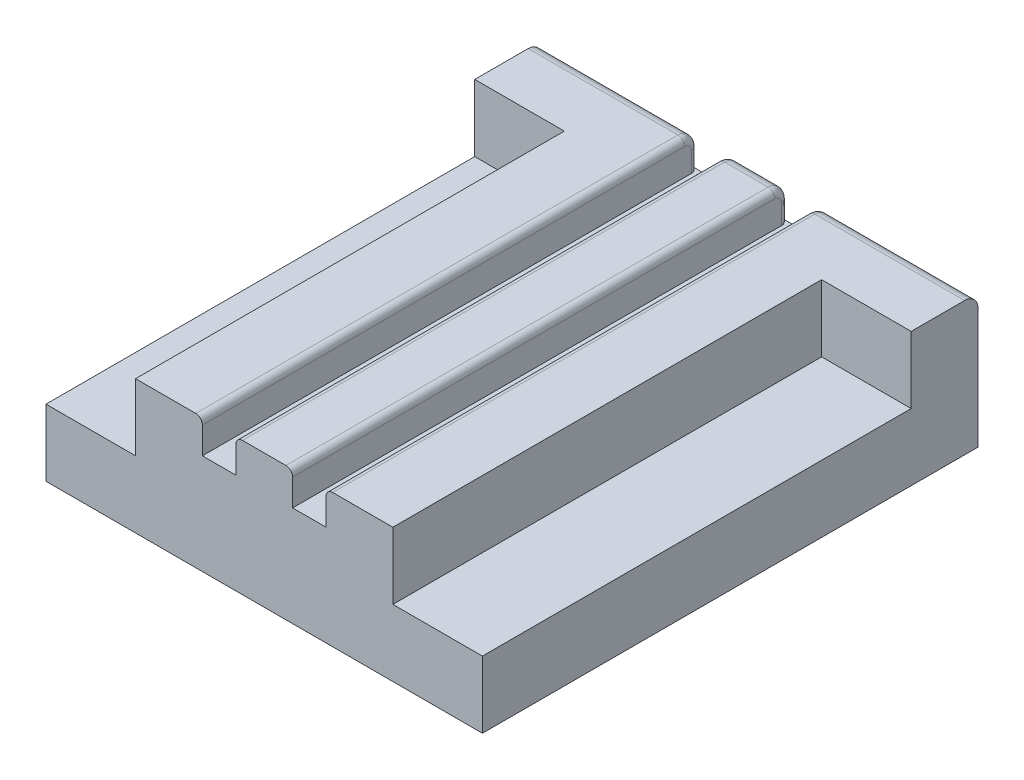
ISO-10303-21;
HEADER;
FILE_DESCRIPTION(('STEP AP214'),'2;1');
FILE_NAME('part.step','',(''),(''),'','','');
FILE_SCHEMA(('AUTOMOTIVE_DESIGN { 1 0 10303 214 1 1 1 1 }'));
ENDSEC;
DATA;
#1=APPLICATION_CONTEXT('core data for automotive mechanical design processes');
#2=APPLICATION_PROTOCOL_DEFINITION('international standard','automotive_design',2000,#1);
#3=PRODUCT_CONTEXT('',#1,'mechanical');
#4=PRODUCT('Part','Part','',(#3));
#5=PRODUCT_RELATED_PRODUCT_CATEGORY('part','',(#4));
#6=PRODUCT_DEFINITION_FORMATION('','',#4);
#7=PRODUCT_DEFINITION_CONTEXT('part definition',#1,'design');
#8=PRODUCT_DEFINITION('design','',#6,#7);
#9=PRODUCT_DEFINITION_SHAPE('','',#8);
#10=(LENGTH_UNIT() NAMED_UNIT(*) SI_UNIT(.MILLI.,.METRE.));
#11=(NAMED_UNIT(*) PLANE_ANGLE_UNIT() SI_UNIT($,.RADIAN.));
#12=(NAMED_UNIT(*) SI_UNIT($,.STERADIAN.) SOLID_ANGLE_UNIT());
#13=UNCERTAINTY_MEASURE_WITH_UNIT(LENGTH_MEASURE(1.E-05),#10,'distance_accuracy_value','');
#14=(GEOMETRIC_REPRESENTATION_CONTEXT(3) GLOBAL_UNCERTAINTY_ASSIGNED_CONTEXT((#13)) GLOBAL_UNIT_ASSIGNED_CONTEXT((#10,
#11,#12)) REPRESENTATION_CONTEXT('',''));
#15=CARTESIAN_POINT('',(0.,0.,0.));
#16=DIRECTION('',(0.,0.,1.));
#17=DIRECTION('',(1.,0.,0.));
#18=AXIS2_PLACEMENT_3D('',#15,#16,#17);
#19=CARTESIAN_POINT('',(0.,20.,0.));
#20=DIRECTION('',(0.,-1.,0.));
#21=DIRECTION('',(0.,0.,-1.));
#22=AXIS2_PLACEMENT_3D('',#19,#20,#21);
#23=PLANE('',#22);
#24=DIRECTION('',(0.,0.,-1.));
#25=VECTOR('',#24,1.);
#26=CARTESIAN_POINT('',(-19.25,20.,-40.5));
#27=LINE('',#26,#25);
#28=CARTESIAN_POINT('',(-19.25,20.,-75.85));
#29=VERTEX_POINT('',#28);
#30=CARTESIAN_POINT('',(-19.25,20.,-140.));
#31=VERTEX_POINT('',#30);
#32=EDGE_CURVE('E265',#29,#31,#27,.T.);
#33=ORIENTED_EDGE('',*,*,#32,.F.);
#34=DIRECTION('',(-1.,0.,0.));
#35=VECTOR('',#34,1.);
#36=CARTESIAN_POINT('',(-120.,20.,-75.85));
#37=LINE('',#36,#35);
#38=CARTESIAN_POINT('',(-10.25,20.,-75.85));
#39=VERTEX_POINT('',#38);
#40=EDGE_CURVE('E258',#39,#29,#37,.T.);
#41=ORIENTED_EDGE('',*,*,#40,.F.);
#42=DIRECTION('',(0.,0.,-1.));
#43=VECTOR('',#42,1.);
#44=CARTESIAN_POINT('',(-10.25,20.,-148.));
#45=LINE('',#44,#43);
#46=CARTESIAN_POINT('',(-10.25,20.,-148.));
#47=VERTEX_POINT('',#46);
#48=EDGE_CURVE('E58',#39,#47,#45,.T.);
#49=ORIENTED_EDGE('',*,*,#48,.T.);
#50=DIRECTION('',(1.,0.,0.));
#51=VECTOR('',#50,1.);
#52=CARTESIAN_POINT('',(-60.,20.,-148.));
#53=LINE('',#52,#51);
#54=CARTESIAN_POINT('',(-32.65,20.,-148.));
#55=VERTEX_POINT('',#54);
#56=EDGE_CURVE('E305',#47,#55,#53,.F.);
#57=ORIENTED_EDGE('',*,*,#56,.T.);
#58=DIRECTION('',(0.,0.,-1.));
#59=VECTOR('',#58,1.);
#60=CARTESIAN_POINT('',(-32.65,20.,-75.85));
#61=LINE('',#60,#59);
#62=CARTESIAN_POINT('',(-32.65,20.,-140.));
#63=VERTEX_POINT('',#62);
#64=EDGE_CURVE('E463',#63,#55,#61,.T.);
#65=ORIENTED_EDGE('',*,*,#64,.F.);
#66=DIRECTION('',(1.,0.,0.));
#67=VECTOR('',#66,1.);
#68=CARTESIAN_POINT('',(0.,20.,-140.));
#69=LINE('',#68,#67);
#70=EDGE_CURVE('E276',#63,#31,#69,.T.);
#71=ORIENTED_EDGE('',*,*,#70,.T.);
#72=EDGE_LOOP('',(#33,#41,#49,#57,#65,#71));
#73=FACE_BOUND('',#72,.T.);
#74=ADVANCED_FACE('F43',(#73),#23,.F.);
#75=DIRECTION('',(0.,0.,-1.));
#76=VECTOR('',#75,1.);
#77=CARTESIAN_POINT('',(10.25,20.,0.));
#78=LINE('',#77,#76);
#79=CARTESIAN_POINT('',(10.25,20.,-148.));
#80=VERTEX_POINT('',#79);
#81=CARTESIAN_POINT('',(10.25,20.,-75.85));
#82=VERTEX_POINT('',#81);
#83=EDGE_CURVE('E254',#80,#82,#78,.F.);
#84=ORIENTED_EDGE('',*,*,#83,.T.);
#85=CARTESIAN_POINT('',(19.25,20.,-75.85));
#86=VERTEX_POINT('',#85);
#87=EDGE_CURVE('E238',#86,#82,#37,.T.);
#88=ORIENTED_EDGE('',*,*,#87,.F.);
#89=DIRECTION('',(0.,0.,-1.));
#90=VECTOR('',#89,1.);
#91=CARTESIAN_POINT('',(19.25,20.,-40.5));
#92=LINE('',#91,#90);
#93=CARTESIAN_POINT('',(19.25,20.,-140.));
#94=VERTEX_POINT('',#93);
#95=EDGE_CURVE('E251',#86,#94,#92,.T.);
#96=ORIENTED_EDGE('',*,*,#95,.T.);
#97=DIRECTION('',(-1.,0.,0.));
#98=VECTOR('',#97,1.);
#99=CARTESIAN_POINT('',(0.,20.,-140.));
#100=LINE('',#99,#98);
#101=CARTESIAN_POINT('',(32.65,20.,-140.));
#102=VERTEX_POINT('',#101);
#103=EDGE_CURVE('E272',#102,#94,#100,.T.);
#104=ORIENTED_EDGE('',*,*,#103,.F.);
#105=DIRECTION('',(0.,0.,1.));
#106=VECTOR('',#105,1.);
#107=CARTESIAN_POINT('',(32.65,20.,-75.85));
#108=LINE('',#107,#106);
#109=CARTESIAN_POINT('',(32.65,20.,-148.));
#110=VERTEX_POINT('',#109);
#111=EDGE_CURVE('E461',#110,#102,#108,.T.);
#112=ORIENTED_EDGE('',*,*,#111,.F.);
#113=EDGE_CURVE('E307',#110,#80,#53,.F.);
#114=ORIENTED_EDGE('',*,*,#113,.T.);
#115=EDGE_LOOP('',(#84,#88,#96,#104,#112,#114));
#116=FACE_BOUND('',#115,.T.);
#117=ADVANCED_FACE('F249',(#116),#23,.F.);
#118=DIRECTION('',(0.,0.,1.));
#119=VECTOR('',#118,1.);
#120=CARTESIAN_POINT('',(-3.24999999999998,20.,-62.85));
#121=LINE('',#120,#119);
#122=CARTESIAN_POINT('',(-3.24999999999998,20.,-148.));
#123=VERTEX_POINT('',#122);
#124=CARTESIAN_POINT('',(-3.24999999999999,20.,-75.85));
#125=VERTEX_POINT('',#124);
#126=EDGE_CURVE('E360',#123,#125,#121,.T.);
#127=ORIENTED_EDGE('',*,*,#126,.T.);
#128=CARTESIAN_POINT('',(3.24999999999999,20.,-75.85));
#129=VERTEX_POINT('',#128);
#130=EDGE_CURVE('E256',#129,#125,#37,.T.);
#131=ORIENTED_EDGE('',*,*,#130,.F.);
#132=DIRECTION('',(0.,0.,1.));
#133=VECTOR('',#132,1.);
#134=CARTESIAN_POINT('',(3.24999999999998,20.,0.));
#135=LINE('',#134,#133);
#136=CARTESIAN_POINT('',(3.24999999999998,20.,-148.));
#137=VERTEX_POINT('',#136);
#138=EDGE_CURVE('E363',#129,#137,#135,.F.);
#139=ORIENTED_EDGE('',*,*,#138,.T.);
#140=EDGE_CURVE('E310',#137,#123,#53,.F.);
#141=ORIENTED_EDGE('',*,*,#140,.T.);
#142=EDGE_LOOP('',(#127,#131,#139,#141));
#143=FACE_BOUND('',#142,.T.);
#144=ADVANCED_FACE('F536',(#143),#23,.F.);
#145=CARTESIAN_POINT('',(0.,18.,-148.));
#146=DIRECTION('',(-1.,0.,0.));
#147=DIRECTION('',(0.,0.,1.));
#148=AXIS2_PLACEMENT_3D('',#145,#146,#147);
#149=CYLINDRICAL_SURFACE('',#148,2.);
#150=ORIENTED_EDGE('',*,*,#140,.F.);
#151=CARTESIAN_POINT('',(3.24999999999998,18.,-148.));
#152=DIRECTION('',(-1.,0.,0.));
#153=DIRECTION('',(0.,0.,1.));
#154=AXIS2_PLACEMENT_3D('',#151,#152,#153);
#155=CIRCLE('',#154,2.);
#156=CARTESIAN_POINT('',(3.24999999999998,18.,-150.));
#157=VERTEX_POINT('',#156);
#158=EDGE_CURVE('E331',#137,#157,#155,.T.);
#159=ORIENTED_EDGE('',*,*,#158,.T.);
#160=DIRECTION('',(1.,0.,0.));
#161=VECTOR('',#160,1.);
#162=CARTESIAN_POINT('',(60.,18.,-150.));
#163=LINE('',#162,#161);
#164=CARTESIAN_POINT('',(-3.24999999999998,18.,-150.));
#165=VERTEX_POINT('',#164);
#166=EDGE_CURVE('E306',#165,#157,#163,.T.);
#167=ORIENTED_EDGE('',*,*,#166,.F.);
#168=CARTESIAN_POINT('',(-3.24999999999998,18.,-148.));
#169=DIRECTION('',(-1.,0.,0.));
#170=DIRECTION('',(0.,0.,1.));
#171=AXIS2_PLACEMENT_3D('',#168,#169,#170);
#172=CIRCLE('',#171,2.);
#173=EDGE_CURVE('E329',#165,#123,#172,.F.);
#174=ORIENTED_EDGE('',*,*,#173,.T.);
#175=EDGE_LOOP('',(#150,#159,#167,#174));
#176=FACE_BOUND('',#175,.T.);
#177=ADVANCED_FACE('F565',(#176),#149,.T.);
#178=CARTESIAN_POINT('',(0.,20.,-150.));
#179=DIRECTION('',(0.,0.,-1.));
#180=DIRECTION('',(-1.,0.,0.));
#181=AXIS2_PLACEMENT_3D('',#178,#179,#180);
#182=PLANE('',#181);
#183=DIRECTION('',(0.,1.,0.));
#184=VECTOR('',#183,1.);
#185=CARTESIAN_POINT('',(32.65,20.,-150.));
#186=LINE('',#185,#184);
#187=CARTESIAN_POINT('',(32.65,0.,-150.));
#188=VERTEX_POINT('',#187);
#189=CARTESIAN_POINT('',(32.65,18.,-150.));
#190=VERTEX_POINT('',#189);
#191=EDGE_CURVE('E475',#188,#190,#186,.T.);
#192=ORIENTED_EDGE('',*,*,#191,.F.);
#193=DIRECTION('',(1.,0.,0.));
#194=VECTOR('',#193,1.);
#195=CARTESIAN_POINT('',(0.,0.,-150.));
#196=LINE('',#195,#194);
#197=CARTESIAN_POINT('',(-32.65,0.,-150.));
#198=VERTEX_POINT('',#197);
#199=EDGE_CURVE('E299',#198,#188,#196,.T.);
#200=ORIENTED_EDGE('',*,*,#199,.F.);
#201=DIRECTION('',(0.,-1.,0.));
#202=VECTOR('',#201,1.);
#203=CARTESIAN_POINT('',(-32.65,20.,-150.));
#204=LINE('',#203,#202);
#205=CARTESIAN_POINT('',(-32.65,18.,-150.));
#206=VERTEX_POINT('',#205);
#207=EDGE_CURVE('E392',#206,#198,#204,.T.);
#208=ORIENTED_EDGE('',*,*,#207,.F.);
#209=CARTESIAN_POINT('',(-10.25,18.,-150.));
#210=VERTEX_POINT('',#209);
#211=EDGE_CURVE('E303',#206,#210,#163,.T.);
#212=ORIENTED_EDGE('',*,*,#211,.T.);
#213=DIRECTION('',(0.,-1.,0.));
#214=VECTOR('',#213,1.);
#215=CARTESIAN_POINT('',(-10.25,20.,-150.));
#216=LINE('',#215,#214);
#217=CARTESIAN_POINT('',(-10.25,15.,-150.));
#218=VERTEX_POINT('',#217);
#219=EDGE_CURVE('E318',#210,#218,#216,.T.);
#220=ORIENTED_EDGE('',*,*,#219,.T.);
#221=DIRECTION('',(-1.,0.,0.));
#222=VECTOR('',#221,1.);
#223=CARTESIAN_POINT('',(0.,15.,-150.));
#224=LINE('',#223,#222);
#225=CARTESIAN_POINT('',(-3.24999999999998,15.,-150.));
#226=VERTEX_POINT('',#225);
#227=EDGE_CURVE('E297',#226,#218,#224,.T.);
#228=ORIENTED_EDGE('',*,*,#227,.F.);
#229=DIRECTION('',(0.,1.,0.));
#230=VECTOR('',#229,1.);
#231=CARTESIAN_POINT('',(-3.24999999999998,20.,-150.));
#232=LINE('',#231,#230);
#233=EDGE_CURVE('E321',#226,#165,#232,.T.);
#234=ORIENTED_EDGE('',*,*,#233,.T.);
#235=ORIENTED_EDGE('',*,*,#166,.T.);
#236=DIRECTION('',(0.,1.,0.));
#237=VECTOR('',#236,1.);
#238=CARTESIAN_POINT('',(3.24999999999998,15.,-150.));
#239=LINE('',#238,#237);
#240=CARTESIAN_POINT('',(3.24999999999998,15.,-150.));
#241=VERTEX_POINT('',#240);
#242=EDGE_CURVE('E326',#157,#241,#239,.F.);
#243=ORIENTED_EDGE('',*,*,#242,.T.);
#244=DIRECTION('',(-1.,0.,0.));
#245=VECTOR('',#244,1.);
#246=CARTESIAN_POINT('',(0.,15.,-150.));
#247=LINE('',#246,#245);
#248=CARTESIAN_POINT('',(10.25,15.,-150.));
#249=VERTEX_POINT('',#248);
#250=EDGE_CURVE('E290',#249,#241,#247,.T.);
#251=ORIENTED_EDGE('',*,*,#250,.F.);
#252=DIRECTION('',(0.,-1.,0.));
#253=VECTOR('',#252,1.);
#254=CARTESIAN_POINT('',(10.25,18.,-150.));
#255=LINE('',#254,#253);
#256=CARTESIAN_POINT('',(10.25,18.,-150.));
#257=VERTEX_POINT('',#256);
#258=EDGE_CURVE('E324',#249,#257,#255,.F.);
#259=ORIENTED_EDGE('',*,*,#258,.T.);
#260=EDGE_CURVE('E302',#257,#190,#163,.T.);
#261=ORIENTED_EDGE('',*,*,#260,.T.);
#262=EDGE_LOOP('',(#192,#200,#208,#212,#220,#228,#234,#235,#243,#251,#259,#261));
#263=FACE_BOUND('',#262,.T.);
#264=ADVANCED_FACE('F489',(#263),#182,.T.);
#265=CARTESIAN_POINT('',(-32.65,18.,-148.));
#266=DIRECTION('',(1.,0.,0.));
#267=DIRECTION('',(0.,0.,-1.));
#268=AXIS2_PLACEMENT_3D('',#265,#266,#267);
#269=CIRCLE('',#268,2.);
#270=EDGE_CURVE('E477',#55,#206,#269,.F.);
#271=ORIENTED_EDGE('',*,*,#270,.F.);
#272=ORIENTED_EDGE('',*,*,#56,.F.);
#273=CARTESIAN_POINT('',(-10.25,18.,-148.));
#274=DIRECTION('',(1.,0.,0.));
#275=DIRECTION('',(0.,0.,-1.));
#276=AXIS2_PLACEMENT_3D('',#273,#274,#275);
#277=CIRCLE('',#276,2.);
#278=EDGE_CURVE('E355',#47,#210,#277,.F.);
#279=ORIENTED_EDGE('',*,*,#278,.T.);
#280=ORIENTED_EDGE('',*,*,#211,.F.);
#281=EDGE_LOOP('',(#271,#272,#279,#280));
#282=FACE_BOUND('',#281,.T.);
#283=ADVANCED_FACE('F543',(#282),#149,.T.);
#284=CARTESIAN_POINT('',(32.65,18.,-148.));
#285=DIRECTION('',(-1.,0.,0.));
#286=DIRECTION('',(0.,0.,1.));
#287=AXIS2_PLACEMENT_3D('',#284,#285,#286);
#288=CIRCLE('',#287,2.);
#289=EDGE_CURVE('E473',#190,#110,#288,.F.);
#290=ORIENTED_EDGE('',*,*,#289,.F.);
#291=ORIENTED_EDGE('',*,*,#260,.F.);
#292=CARTESIAN_POINT('',(10.25,18.,-148.));
#293=DIRECTION('',(1.,0.,0.));
#294=DIRECTION('',(0.,0.,-1.));
#295=AXIS2_PLACEMENT_3D('',#292,#293,#294);
#296=CIRCLE('',#295,2.);
#297=EDGE_CURVE('E340',#257,#80,#296,.T.);
#298=ORIENTED_EDGE('',*,*,#297,.T.);
#299=ORIENTED_EDGE('',*,*,#113,.F.);
#300=EDGE_LOOP('',(#290,#291,#298,#299));
#301=FACE_BOUND('',#300,.T.);
#302=ADVANCED_FACE('F497',(#301),#149,.T.);
#303=CARTESIAN_POINT('',(0.,0.,0.));
#304=DIRECTION('',(0.,-1.,0.));
#305=DIRECTION('',(0.,0.,-1.));
#306=AXIS2_PLACEMENT_3D('',#303,#304,#305);
#307=PLANE('',#306);
#308=DIRECTION('',(-1.,0.,0.));
#309=VECTOR('',#308,1.);
#310=CARTESIAN_POINT('',(-120.,0.,-75.85));
#311=LINE('',#310,#309);
#312=CARTESIAN_POINT('',(32.65,0.,-75.85));
#313=VERTEX_POINT('',#312);
#314=CARTESIAN_POINT('',(-32.65,0.,-75.85));
#315=VERTEX_POINT('',#314);
#316=EDGE_CURVE('E255',#313,#315,#311,.T.);
#317=ORIENTED_EDGE('',*,*,#316,.T.);
#318=DIRECTION('',(0.,0.,-1.));
#319=VECTOR('',#318,1.);
#320=CARTESIAN_POINT('',(-32.65,0.,-75.85));
#321=LINE('',#320,#319);
#322=EDGE_CURVE('E466',#315,#198,#321,.T.);
#323=ORIENTED_EDGE('',*,*,#322,.T.);
#324=ORIENTED_EDGE('',*,*,#199,.T.);
#325=DIRECTION('',(0.,0.,1.));
#326=VECTOR('',#325,1.);
#327=CARTESIAN_POINT('',(32.65,0.,-75.85));
#328=LINE('',#327,#326);
#329=EDGE_CURVE('E460',#188,#313,#328,.T.);
#330=ORIENTED_EDGE('',*,*,#329,.T.);
#331=EDGE_LOOP('',(#317,#323,#324,#330));
#332=FACE_BOUND('',#331,.T.);
#333=ADVANCED_FACE('F487',(#332),#307,.T.);
#334=CARTESIAN_POINT('',(-9.24999999999998,15.,-40.5));
#335=DIRECTION('',(1.,0.,0.));
#336=DIRECTION('',(0.,0.,-1.));
#337=AXIS2_PLACEMENT_3D('',#334,#335,#336);
#338=PLANE('',#337);
#339=DIRECTION('',(0.,1.,0.));
#340=VECTOR('',#339,1.);
#341=CARTESIAN_POINT('',(-9.24999999999998,15.,-75.85));
#342=LINE('',#341,#340);
#343=CARTESIAN_POINT('',(-9.24999999999998,15.,-75.85));
#344=VERTEX_POINT('',#343);
#345=CARTESIAN_POINT('',(-9.24999999999998,19.,-75.85));
#346=VERTEX_POINT('',#345);
#347=EDGE_CURVE('E438',#344,#346,#342,.T.);
#348=ORIENTED_EDGE('',*,*,#347,.F.);
#349=DIRECTION('',(0.,0.,-1.));
#350=VECTOR('',#349,1.);
#351=CARTESIAN_POINT('',(-9.24999999999998,15.,-40.5));
#352=LINE('',#351,#350);
#353=CARTESIAN_POINT('',(-9.24999999999998,15.,-149.));
#354=VERTEX_POINT('',#353);
#355=EDGE_CURVE('E295',#344,#354,#352,.T.);
#356=ORIENTED_EDGE('',*,*,#355,.T.);
#357=DIRECTION('',(0.,-1.,0.));
#358=VECTOR('',#357,1.);
#359=CARTESIAN_POINT('',(-9.24999999999998,15.,-149.));
#360=LINE('',#359,#358);
#361=CARTESIAN_POINT('',(-9.24999999999998,18.,-149.));
#362=VERTEX_POINT('',#361);
#363=EDGE_CURVE('E66',#354,#362,#360,.F.);
#364=ORIENTED_EDGE('',*,*,#363,.T.);
#365=CARTESIAN_POINT('',(-9.24999999999998,18.,-148.));
#366=DIRECTION('',(1.,0.,0.));
#367=DIRECTION('',(0.,0.,-1.));
#368=AXIS2_PLACEMENT_3D('',#365,#366,#367);
#369=CIRCLE('',#368,1.);
#370=CARTESIAN_POINT('',(-9.24999999999998,19.,-148.));
#371=VERTEX_POINT('',#370);
#372=EDGE_CURVE('E352',#362,#371,#369,.T.);
#373=ORIENTED_EDGE('',*,*,#372,.T.);
#374=DIRECTION('',(0.,0.,-1.));
#375=VECTOR('',#374,1.);
#376=CARTESIAN_POINT('',(-9.24999999999998,19.,-62.85));
#377=LINE('',#376,#375);
#378=EDGE_CURVE('E349',#371,#346,#377,.F.);
#379=ORIENTED_EDGE('',*,*,#378,.T.);
#380=EDGE_LOOP('',(#348,#356,#364,#373,#379));
#381=FACE_BOUND('',#380,.T.);
#382=ADVANCED_FACE('F577',(#381),#338,.T.);
#383=CARTESIAN_POINT('',(-4.24999999999998,15.,-156.832928993889));
#384=DIRECTION('',(-1.,0.,0.));
#385=DIRECTION('',(0.,0.,1.));
#386=AXIS2_PLACEMENT_3D('',#383,#384,#385);
#387=PLANE('',#386);
#388=DIRECTION('',(0.,-1.,0.));
#389=VECTOR('',#388,1.);
#390=CARTESIAN_POINT('',(-4.24999999999998,15.,-75.85));
#391=LINE('',#390,#389);
#392=CARTESIAN_POINT('',(-4.24999999999998,19.,-75.85));
#393=VERTEX_POINT('',#392);
#394=CARTESIAN_POINT('',(-4.24999999999998,15.,-75.85));
#395=VERTEX_POINT('',#394);
#396=EDGE_CURVE('E443',#393,#395,#391,.T.);
#397=ORIENTED_EDGE('',*,*,#396,.F.);
#398=DIRECTION('',(0.,0.,1.));
#399=VECTOR('',#398,1.);
#400=CARTESIAN_POINT('',(-4.24999999999998,19.,-148.));
#401=LINE('',#400,#399);
#402=CARTESIAN_POINT('',(-4.24999999999998,19.,-148.));
#403=VERTEX_POINT('',#402);
#404=EDGE_CURVE('E343',#393,#403,#401,.F.);
#405=ORIENTED_EDGE('',*,*,#404,.T.);
#406=CARTESIAN_POINT('',(-4.24999999999998,18.,-148.));
#407=DIRECTION('',(-1.,0.,0.));
#408=DIRECTION('',(0.,0.,1.));
#409=AXIS2_PLACEMENT_3D('',#406,#407,#408);
#410=CIRCLE('',#409,1.);
#411=CARTESIAN_POINT('',(-4.24999999999998,18.,-149.));
#412=VERTEX_POINT('',#411);
#413=EDGE_CURVE('E345',#403,#412,#410,.T.);
#414=ORIENTED_EDGE('',*,*,#413,.T.);
#415=DIRECTION('',(0.,1.,0.));
#416=VECTOR('',#415,1.);
#417=CARTESIAN_POINT('',(-4.24999999999998,15.,-149.));
#418=LINE('',#417,#416);
#419=CARTESIAN_POINT('',(-4.24999999999998,15.,-149.));
#420=VERTEX_POINT('',#419);
#421=EDGE_CURVE('E347',#412,#420,#418,.F.);
#422=ORIENTED_EDGE('',*,*,#421,.T.);
#423=DIRECTION('',(0.,0.,1.));
#424=VECTOR('',#423,1.);
#425=CARTESIAN_POINT('',(-4.24999999999998,15.,-33.1628994005155));
#426=LINE('',#425,#424);
#427=EDGE_CURVE('E292',#420,#395,#426,.T.);
#428=ORIENTED_EDGE('',*,*,#427,.T.);
#429=EDGE_LOOP('',(#397,#405,#414,#422,#428));
#430=FACE_BOUND('',#429,.T.);
#431=ADVANCED_FACE('F575',(#430),#387,.T.);
#432=CARTESIAN_POINT('',(0.,15.,0.));
#433=DIRECTION('',(0.,-1.,0.));
#434=DIRECTION('',(0.,0.,1.));
#435=AXIS2_PLACEMENT_3D('',#432,#433,#434);
#436=PLANE('',#435);
#437=ORIENTED_EDGE('',*,*,#355,.F.);
#438=DIRECTION('',(1.,0.,0.));
#439=VECTOR('',#438,1.);
#440=CARTESIAN_POINT('',(0.,15.,-75.85));
#441=LINE('',#440,#439);
#442=EDGE_CURVE('E440',#344,#395,#441,.T.);
#443=ORIENTED_EDGE('',*,*,#442,.T.);
#444=ORIENTED_EDGE('',*,*,#427,.F.);
#445=CARTESIAN_POINT('',(-3.24999999999998,15.,-149.));
#446=DIRECTION('',(0.,-1.,0.));
#447=DIRECTION('',(0.,0.,-1.));
#448=AXIS2_PLACEMENT_3D('',#445,#446,#447);
#449=CIRCLE('',#448,1.);
#450=EDGE_CURVE('E370',#420,#226,#449,.T.);
#451=ORIENTED_EDGE('',*,*,#450,.T.);
#452=ORIENTED_EDGE('',*,*,#227,.T.);
#453=CARTESIAN_POINT('',(-10.25,15.,-149.));
#454=DIRECTION('',(0.,-1.,0.));
#455=DIRECTION('',(0.,0.,-1.));
#456=AXIS2_PLACEMENT_3D('',#453,#454,#455);
#457=CIRCLE('',#456,1.);
#458=EDGE_CURVE('E373',#218,#354,#457,.T.);
#459=ORIENTED_EDGE('',*,*,#458,.T.);
#460=EDGE_LOOP('',(#437,#443,#444,#451,#452,#459));
#461=FACE_BOUND('',#460,.T.);
#462=ADVANCED_FACE('F553',(#461),#436,.F.);
#463=CARTESIAN_POINT('',(4.24999999999998,15.,-33.1628994005155));
#464=DIRECTION('',(-1.,0.,0.));
#465=DIRECTION('',(0.,0.,1.));
#466=AXIS2_PLACEMENT_3D('',#463,#464,#465);
#467=PLANE('',#466);
#468=DIRECTION('',(0.,0.,1.));
#469=VECTOR('',#468,1.);
#470=CARTESIAN_POINT('',(4.24999999999998,19.,-33.1628994005155));
#471=LINE('',#470,#469);
#472=CARTESIAN_POINT('',(4.24999999999998,19.,-148.));
#473=VERTEX_POINT('',#472);
#474=CARTESIAN_POINT('',(4.24999999999998,19.,-75.85));
#475=VERTEX_POINT('',#474);
#476=EDGE_CURVE('E309',#473,#475,#471,.T.);
#477=ORIENTED_EDGE('',*,*,#476,.T.);
#478=DIRECTION('',(0.,-1.,0.));
#479=VECTOR('',#478,1.);
#480=CARTESIAN_POINT('',(4.24999999999998,15.,-75.85));
#481=LINE('',#480,#479);
#482=CARTESIAN_POINT('',(4.24999999999998,15.,-75.85));
#483=VERTEX_POINT('',#482);
#484=EDGE_CURVE('E455',#475,#483,#481,.T.);
#485=ORIENTED_EDGE('',*,*,#484,.T.);
#486=DIRECTION('',(0.,0.,1.));
#487=VECTOR('',#486,1.);
#488=CARTESIAN_POINT('',(4.24999999999998,15.,-156.832928993889));
#489=LINE('',#488,#487);
#490=CARTESIAN_POINT('',(4.24999999999998,15.,-149.));
#491=VERTEX_POINT('',#490);
#492=EDGE_CURVE('E287',#491,#483,#489,.T.);
#493=ORIENTED_EDGE('',*,*,#492,.F.);
#494=DIRECTION('',(0.,1.,0.));
#495=VECTOR('',#494,1.);
#496=CARTESIAN_POINT('',(4.24999999999998,18.,-149.));
#497=LINE('',#496,#495);
#498=CARTESIAN_POINT('',(4.24999999999998,18.,-149.));
#499=VERTEX_POINT('',#498);
#500=EDGE_CURVE('E315',#491,#499,#497,.T.);
#501=ORIENTED_EDGE('',*,*,#500,.T.);
#502=CARTESIAN_POINT('',(4.24999999999998,18.,-148.));
#503=DIRECTION('',(-1.,0.,0.));
#504=DIRECTION('',(0.,0.,1.));
#505=AXIS2_PLACEMENT_3D('',#502,#503,#504);
#506=CIRCLE('',#505,1.);
#507=EDGE_CURVE('E313',#499,#473,#506,.F.);
#508=ORIENTED_EDGE('',*,*,#507,.T.);
#509=EDGE_LOOP('',(#477,#485,#493,#501,#508));
#510=FACE_BOUND('',#509,.T.);
#511=ADVANCED_FACE('F518',(#510),#467,.F.);
#512=CARTESIAN_POINT('',(9.24999999999998,15.,-40.5));
#513=DIRECTION('',(1.,0.,0.));
#514=DIRECTION('',(0.,0.,-1.));
#515=AXIS2_PLACEMENT_3D('',#512,#513,#514);
#516=PLANE('',#515);
#517=DIRECTION('',(0.,0.,-1.));
#518=VECTOR('',#517,1.);
#519=CARTESIAN_POINT('',(9.24999999999998,15.,-40.5));
#520=LINE('',#519,#518);
#521=CARTESIAN_POINT('',(9.24999999999998,15.,-75.85));
#522=VERTEX_POINT('',#521);
#523=CARTESIAN_POINT('',(9.24999999999998,15.,-149.));
#524=VERTEX_POINT('',#523);
#525=EDGE_CURVE('E285',#522,#524,#520,.T.);
#526=ORIENTED_EDGE('',*,*,#525,.F.);
#527=DIRECTION('',(0.,1.,0.));
#528=VECTOR('',#527,1.);
#529=CARTESIAN_POINT('',(9.24999999999998,15.,-75.85));
#530=LINE('',#529,#528);
#531=CARTESIAN_POINT('',(9.24999999999998,19.,-75.85));
#532=VERTEX_POINT('',#531);
#533=EDGE_CURVE('E449',#522,#532,#530,.T.);
#534=ORIENTED_EDGE('',*,*,#533,.T.);
#535=DIRECTION('',(0.,0.,-1.));
#536=VECTOR('',#535,1.);
#537=CARTESIAN_POINT('',(9.24999999999998,19.,-40.5));
#538=LINE('',#537,#536);
#539=CARTESIAN_POINT('',(9.24999999999998,19.,-148.));
#540=VERTEX_POINT('',#539);
#541=EDGE_CURVE('E333',#532,#540,#538,.T.);
#542=ORIENTED_EDGE('',*,*,#541,.T.);
#543=CARTESIAN_POINT('',(9.24999999999998,18.,-148.));
#544=DIRECTION('',(1.,0.,0.));
#545=DIRECTION('',(0.,0.,-1.));
#546=AXIS2_PLACEMENT_3D('',#543,#544,#545);
#547=CIRCLE('',#546,1.);
#548=CARTESIAN_POINT('',(9.24999999999998,18.,-149.));
#549=VERTEX_POINT('',#548);
#550=EDGE_CURVE('E335',#540,#549,#547,.F.);
#551=ORIENTED_EDGE('',*,*,#550,.T.);
#552=DIRECTION('',(0.,-1.,0.));
#553=VECTOR('',#552,1.);
#554=CARTESIAN_POINT('',(9.24999999999998,15.,-149.));
#555=LINE('',#554,#553);
#556=EDGE_CURVE('E337',#549,#524,#555,.T.);
#557=ORIENTED_EDGE('',*,*,#556,.T.);
#558=EDGE_LOOP('',(#526,#534,#542,#551,#557));
#559=FACE_BOUND('',#558,.T.);
#560=ADVANCED_FACE('F510',(#559),#516,.F.);
#561=CARTESIAN_POINT('',(0.,15.,0.));
#562=DIRECTION('',(0.,-1.,0.));
#563=DIRECTION('',(0.,0.,1.));
#564=AXIS2_PLACEMENT_3D('',#561,#562,#563);
#565=PLANE('',#564);
#566=ORIENTED_EDGE('',*,*,#492,.T.);
#567=DIRECTION('',(1.,0.,0.));
#568=VECTOR('',#567,1.);
#569=CARTESIAN_POINT('',(0.,15.,-75.85));
#570=LINE('',#569,#568);
#571=EDGE_CURVE('E452',#483,#522,#570,.T.);
#572=ORIENTED_EDGE('',*,*,#571,.T.);
#573=ORIENTED_EDGE('',*,*,#525,.T.);
#574=CARTESIAN_POINT('',(10.25,15.,-149.));
#575=DIRECTION('',(0.,-1.,0.));
#576=DIRECTION('',(0.,0.,-1.));
#577=AXIS2_PLACEMENT_3D('',#574,#575,#576);
#578=CIRCLE('',#577,1.);
#579=EDGE_CURVE('E367',#524,#249,#578,.T.);
#580=ORIENTED_EDGE('',*,*,#579,.T.);
#581=ORIENTED_EDGE('',*,*,#250,.T.);
#582=CARTESIAN_POINT('',(3.24999999999998,15.,-149.));
#583=DIRECTION('',(0.,-1.,0.));
#584=DIRECTION('',(0.,0.,-1.));
#585=AXIS2_PLACEMENT_3D('',#582,#583,#584);
#586=CIRCLE('',#585,1.);
#587=EDGE_CURVE('E365',#241,#491,#586,.T.);
#588=ORIENTED_EDGE('',*,*,#587,.T.);
#589=EDGE_LOOP('',(#566,#572,#573,#580,#581,#588));
#590=FACE_BOUND('',#589,.T.);
#591=ADVANCED_FACE('F512',(#590),#565,.F.);
#592=CARTESIAN_POINT('',(0.,20.,-140.));
#593=DIRECTION('',(0.,0.,-1.));
#594=DIRECTION('',(-1.,0.,0.));
#595=AXIS2_PLACEMENT_3D('',#592,#593,#594);
#596=PLANE('',#595);
#597=ORIENTED_EDGE('',*,*,#70,.F.);
#598=DIRECTION('',(0.,-1.,0.));
#599=VECTOR('',#598,1.);
#600=CARTESIAN_POINT('',(-32.65,20.,-140.));
#601=LINE('',#600,#599);
#602=CARTESIAN_POINT('',(-32.65,10.,-140.));
#603=VERTEX_POINT('',#602);
#604=EDGE_CURVE('E422',#63,#603,#601,.T.);
#605=ORIENTED_EDGE('',*,*,#604,.T.);
#606=DIRECTION('',(1.,0.,0.));
#607=VECTOR('',#606,1.);
#608=CARTESIAN_POINT('',(0.,10.,-140.));
#609=LINE('',#608,#607);
#610=CARTESIAN_POINT('',(-19.25,10.,-140.));
#611=VERTEX_POINT('',#610);
#612=EDGE_CURVE('E406',#603,#611,#609,.T.);
#613=ORIENTED_EDGE('',*,*,#612,.T.);
#614=DIRECTION('',(0.,-1.,0.));
#615=VECTOR('',#614,1.);
#616=CARTESIAN_POINT('',(-19.25,20.,-140.));
#617=LINE('',#616,#615);
#618=EDGE_CURVE('E275',#31,#611,#617,.T.);
#619=ORIENTED_EDGE('',*,*,#618,.F.);
#620=EDGE_LOOP('',(#597,#605,#613,#619));
#621=FACE_BOUND('',#620,.T.);
#622=ADVANCED_FACE('F419',(#621),#596,.F.);
#623=CARTESIAN_POINT('',(0.,10.,0.));
#624=DIRECTION('',(0.,-1.,0.));
#625=DIRECTION('',(0.,0.,-1.));
#626=AXIS2_PLACEMENT_3D('',#623,#624,#625);
#627=PLANE('',#626);
#628=DIRECTION('',(0.,0.,1.));
#629=VECTOR('',#628,1.);
#630=CARTESIAN_POINT('',(-32.65,10.,0.));
#631=LINE('',#630,#629);
#632=CARTESIAN_POINT('',(-32.65,10.,-75.85));
#633=VERTEX_POINT('',#632);
#634=EDGE_CURVE('E11',#603,#633,#631,.T.);
#635=ORIENTED_EDGE('',*,*,#634,.T.);
#636=DIRECTION('',(1.,0.,0.));
#637=VECTOR('',#636,1.);
#638=CARTESIAN_POINT('',(0.,10.,-75.85));
#639=LINE('',#638,#637);
#640=CARTESIAN_POINT('',(-19.25,10.,-75.85));
#641=VERTEX_POINT('',#640);
#642=EDGE_CURVE('E426',#633,#641,#639,.T.);
#643=ORIENTED_EDGE('',*,*,#642,.T.);
#644=DIRECTION('',(0.,0.,1.));
#645=VECTOR('',#644,1.);
#646=CARTESIAN_POINT('',(-19.25,10.,0.));
#647=LINE('',#646,#645);
#648=EDGE_CURVE('E282',#611,#641,#647,.T.);
#649=ORIENTED_EDGE('',*,*,#648,.F.);
#650=ORIENTED_EDGE('',*,*,#612,.F.);
#651=EDGE_LOOP('',(#635,#643,#649,#650));
#652=FACE_BOUND('',#651,.T.);
#653=ADVANCED_FACE('F425',(#652),#627,.F.);
#654=CARTESIAN_POINT('',(-19.25,15.,-40.5));
#655=DIRECTION('',(1.,0.,0.));
#656=DIRECTION('',(0.,0.,-1.));
#657=AXIS2_PLACEMENT_3D('',#654,#655,#656);
#658=PLANE('',#657);
#659=ORIENTED_EDGE('',*,*,#648,.T.);
#660=DIRECTION('',(0.,1.,0.));
#661=VECTOR('',#660,1.);
#662=CARTESIAN_POINT('',(-19.25,15.,-75.85));
#663=LINE('',#662,#661);
#664=EDGE_CURVE('E428',#641,#29,#663,.T.);
#665=ORIENTED_EDGE('',*,*,#664,.T.);
#666=ORIENTED_EDGE('',*,*,#32,.T.);
#667=ORIENTED_EDGE('',*,*,#618,.T.);
#668=EDGE_LOOP('',(#659,#665,#666,#667));
#669=FACE_BOUND('',#668,.T.);
#670=ADVANCED_FACE('F413',(#669),#658,.F.);
#671=CARTESIAN_POINT('',(19.25,15.,-40.5));
#672=DIRECTION('',(1.,0.,0.));
#673=DIRECTION('',(0.,0.,-1.));
#674=AXIS2_PLACEMENT_3D('',#671,#672,#673);
#675=PLANE('',#674);
#676=DIRECTION('',(0.,1.,0.));
#677=VECTOR('',#676,1.);
#678=CARTESIAN_POINT('',(19.25,15.,-75.85));
#679=LINE('',#678,#677);
#680=CARTESIAN_POINT('',(19.25,10.,-75.85));
#681=VERTEX_POINT('',#680);
#682=EDGE_CURVE('E235',#681,#86,#679,.T.);
#683=ORIENTED_EDGE('',*,*,#682,.F.);
#684=DIRECTION('',(0.,0.,-1.));
#685=VECTOR('',#684,1.);
#686=CARTESIAN_POINT('',(19.25,10.,-40.5));
#687=LINE('',#686,#685);
#688=CARTESIAN_POINT('',(19.25,10.,-140.));
#689=VERTEX_POINT('',#688);
#690=EDGE_CURVE('E280',#681,#689,#687,.T.);
#691=ORIENTED_EDGE('',*,*,#690,.T.);
#692=DIRECTION('',(0.,-1.,0.));
#693=VECTOR('',#692,1.);
#694=CARTESIAN_POINT('',(19.25,20.,-140.));
#695=LINE('',#694,#693);
#696=EDGE_CURVE('E262',#94,#689,#695,.T.);
#697=ORIENTED_EDGE('',*,*,#696,.F.);
#698=ORIENTED_EDGE('',*,*,#95,.F.);
#699=EDGE_LOOP('',(#683,#691,#697,#698));
#700=FACE_BOUND('',#699,.T.);
#701=ADVANCED_FACE('F260',(#700),#675,.T.);
#702=CARTESIAN_POINT('',(32.65,10.,-140.));
#703=VERTEX_POINT('',#702);
#704=EDGE_CURVE('E279',#689,#703,#609,.T.);
#705=ORIENTED_EDGE('',*,*,#704,.T.);
#706=DIRECTION('',(0.,1.,0.));
#707=VECTOR('',#706,1.);
#708=CARTESIAN_POINT('',(32.65,20.,-140.));
#709=LINE('',#708,#707);
#710=EDGE_CURVE('E405',#703,#102,#709,.T.);
#711=ORIENTED_EDGE('',*,*,#710,.T.);
#712=ORIENTED_EDGE('',*,*,#103,.T.);
#713=ORIENTED_EDGE('',*,*,#696,.T.);
#714=EDGE_LOOP('',(#705,#711,#712,#713));
#715=FACE_BOUND('',#714,.T.);
#716=ADVANCED_FACE('F404',(#715),#596,.F.);
#717=ORIENTED_EDGE('',*,*,#690,.F.);
#718=DIRECTION('',(1.,0.,0.));
#719=VECTOR('',#718,1.);
#720=CARTESIAN_POINT('',(0.,10.,-75.85));
#721=LINE('',#720,#719);
#722=CARTESIAN_POINT('',(32.65,10.,-75.85));
#723=VERTEX_POINT('',#722);
#724=EDGE_CURVE('E241',#681,#723,#721,.T.);
#725=ORIENTED_EDGE('',*,*,#724,.T.);
#726=DIRECTION('',(0.,0.,-1.));
#727=VECTOR('',#726,1.);
#728=CARTESIAN_POINT('',(32.65,10.,0.));
#729=LINE('',#728,#727);
#730=EDGE_CURVE('E51',#723,#703,#729,.T.);
#731=ORIENTED_EDGE('',*,*,#730,.T.);
#732=ORIENTED_EDGE('',*,*,#704,.F.);
#733=EDGE_LOOP('',(#717,#725,#731,#732));
#734=FACE_BOUND('',#733,.T.);
#735=ADVANCED_FACE('F399',(#734),#627,.F.);
#736=CARTESIAN_POINT('',(3.24999999999998,19.,-33.1628994005155));
#737=DIRECTION('',(0.,0.,1.));
#738=DIRECTION('',(1.,0.,0.));
#739=AXIS2_PLACEMENT_3D('',#736,#737,#738);
#740=CYLINDRICAL_SURFACE('',#739,1.);
#741=CARTESIAN_POINT('',(3.24999999999998,19.,-75.85));
#742=DIRECTION('',(0.,0.,-1.));
#743=DIRECTION('',(-1.,0.,0.));
#744=AXIS2_PLACEMENT_3D('',#741,#742,#743);
#745=CIRCLE('',#744,1.);
#746=EDGE_CURVE('E436',#475,#129,#745,.F.);
#747=ORIENTED_EDGE('',*,*,#746,.F.);
#748=ORIENTED_EDGE('',*,*,#476,.F.);
#749=CARTESIAN_POINT('',(3.24999999999998,19.,-148.));
#750=DIRECTION('',(0.,0.,-1.));
#751=DIRECTION('',(-1.,0.,0.));
#752=AXIS2_PLACEMENT_3D('',#749,#750,#751);
#753=CIRCLE('',#752,1.);
#754=EDGE_CURVE('E263',#137,#473,#753,.T.);
#755=ORIENTED_EDGE('',*,*,#754,.F.);
#756=ORIENTED_EDGE('',*,*,#138,.F.);
#757=EDGE_LOOP('',(#747,#748,#755,#756));
#758=FACE_BOUND('',#757,.T.);
#759=ADVANCED_FACE('F531',(#758),#740,.T.);
#760=CARTESIAN_POINT('',(3.24999999999998,18.,-148.));
#761=DIRECTION('',(-1.,0.,0.));
#762=DIRECTION('',(0.,0.,1.));
#763=AXIS2_PLACEMENT_3D('',#760,#761,#762);
#764=DEGENERATE_TOROIDAL_SURFACE('',#763,1.,1.,.T.);
#765=ORIENTED_EDGE('',*,*,#754,.T.);
#766=ORIENTED_EDGE('',*,*,#507,.F.);
#767=CARTESIAN_POINT('',(3.24999999999998,18.,-149.));
#768=DIRECTION('',(0.,-1.,0.));
#769=DIRECTION('',(0.,0.,-1.));
#770=AXIS2_PLACEMENT_3D('',#767,#768,#769);
#771=CIRCLE('',#770,1.);
#772=EDGE_CURVE('E268',#157,#499,#771,.T.);
#773=ORIENTED_EDGE('',*,*,#772,.F.);
#774=ORIENTED_EDGE('',*,*,#158,.F.);
#775=EDGE_LOOP('',(#765,#766,#773,#774));
#776=FACE_BOUND('',#775,.T.);
#777=ADVANCED_FACE('F526',(#776),#764,.T.);
#778=CARTESIAN_POINT('',(3.24999999999998,15.,-149.));
#779=DIRECTION('',(0.,-1.,0.));
#780=DIRECTION('',(0.,0.,-1.));
#781=AXIS2_PLACEMENT_3D('',#778,#779,#780);
#782=CYLINDRICAL_SURFACE('',#781,1.);
#783=ORIENTED_EDGE('',*,*,#587,.F.);
#784=ORIENTED_EDGE('',*,*,#242,.F.);
#785=ORIENTED_EDGE('',*,*,#772,.T.);
#786=ORIENTED_EDGE('',*,*,#500,.F.);
#787=EDGE_LOOP('',(#783,#784,#785,#786));
#788=FACE_BOUND('',#787,.T.);
#789=ADVANCED_FACE('F520',(#788),#782,.T.);
#790=CARTESIAN_POINT('',(10.25,19.,-40.5));
#791=DIRECTION('',(0.,0.,-1.));
#792=DIRECTION('',(-1.,0.,0.));
#793=AXIS2_PLACEMENT_3D('',#790,#791,#792);
#794=CYLINDRICAL_SURFACE('',#793,1.);
#795=CARTESIAN_POINT('',(10.25,19.,-75.85));
#796=DIRECTION('',(0.,0.,-1.));
#797=DIRECTION('',(-1.,0.,0.));
#798=AXIS2_PLACEMENT_3D('',#795,#796,#797);
#799=CIRCLE('',#798,1.);
#800=EDGE_CURVE('E447',#82,#532,#799,.F.);
#801=ORIENTED_EDGE('',*,*,#800,.F.);
#802=ORIENTED_EDGE('',*,*,#83,.F.);
#803=CARTESIAN_POINT('',(10.25,19.,-148.));
#804=DIRECTION('',(0.,0.,-1.));
#805=DIRECTION('',(-1.,0.,0.));
#806=AXIS2_PLACEMENT_3D('',#803,#804,#805);
#807=CIRCLE('',#806,1.);
#808=EDGE_CURVE('E376',#540,#80,#807,.T.);
#809=ORIENTED_EDGE('',*,*,#808,.F.);
#810=ORIENTED_EDGE('',*,*,#541,.F.);
#811=EDGE_LOOP('',(#801,#802,#809,#810));
#812=FACE_BOUND('',#811,.T.);
#813=ADVANCED_FACE('F503',(#812),#794,.T.);
#814=CARTESIAN_POINT('',(10.25,18.,-148.));
#815=DIRECTION('',(1.,0.,0.));
#816=DIRECTION('',(0.,0.,-1.));
#817=AXIS2_PLACEMENT_3D('',#814,#815,#816);
#818=DEGENERATE_TOROIDAL_SURFACE('',#817,1.,1.,.T.);
#819=ORIENTED_EDGE('',*,*,#808,.T.);
#820=ORIENTED_EDGE('',*,*,#297,.F.);
#821=CARTESIAN_POINT('',(10.25,18.,-149.));
#822=DIRECTION('',(0.,-1.,0.));
#823=DIRECTION('',(0.,0.,-1.));
#824=AXIS2_PLACEMENT_3D('',#821,#822,#823);
#825=CIRCLE('',#824,1.);
#826=EDGE_CURVE('E378',#549,#257,#825,.T.);
#827=ORIENTED_EDGE('',*,*,#826,.F.);
#828=ORIENTED_EDGE('',*,*,#550,.F.);
#829=EDGE_LOOP('',(#819,#820,#827,#828));
#830=FACE_BOUND('',#829,.T.);
#831=ADVANCED_FACE('F506',(#830),#818,.T.);
#832=CARTESIAN_POINT('',(10.25,15.,-149.));
#833=DIRECTION('',(0.,1.,0.));
#834=DIRECTION('',(0.,0.,1.));
#835=AXIS2_PLACEMENT_3D('',#832,#833,#834);
#836=CYLINDRICAL_SURFACE('',#835,1.);
#837=ORIENTED_EDGE('',*,*,#826,.T.);
#838=ORIENTED_EDGE('',*,*,#258,.F.);
#839=ORIENTED_EDGE('',*,*,#579,.F.);
#840=ORIENTED_EDGE('',*,*,#556,.F.);
#841=EDGE_LOOP('',(#837,#838,#839,#840));
#842=FACE_BOUND('',#841,.T.);
#843=ADVANCED_FACE('F635',(#842),#836,.T.);
#844=CARTESIAN_POINT('',(-3.24999999999998,19.,0.));
#845=DIRECTION('',(0.,0.,-1.));
#846=DIRECTION('',(-1.,0.,0.));
#847=AXIS2_PLACEMENT_3D('',#844,#845,#846);
#848=CYLINDRICAL_SURFACE('',#847,1.);
#849=CARTESIAN_POINT('',(-3.24999999999998,19.,-75.85));
#850=DIRECTION('',(0.,0.,-1.));
#851=DIRECTION('',(-1.,0.,0.));
#852=AXIS2_PLACEMENT_3D('',#849,#850,#851);
#853=CIRCLE('',#852,1.);
#854=EDGE_CURVE('E445',#125,#393,#853,.F.);
#855=ORIENTED_EDGE('',*,*,#854,.F.);
#856=ORIENTED_EDGE('',*,*,#126,.F.);
#857=CARTESIAN_POINT('',(-3.24999999999998,19.,-148.));
#858=DIRECTION('',(0.,0.,-1.));
#859=DIRECTION('',(-1.,0.,0.));
#860=AXIS2_PLACEMENT_3D('',#857,#858,#859);
#861=CIRCLE('',#860,1.);
#862=EDGE_CURVE('E381',#403,#123,#861,.T.);
#863=ORIENTED_EDGE('',*,*,#862,.F.);
#864=ORIENTED_EDGE('',*,*,#404,.F.);
#865=EDGE_LOOP('',(#855,#856,#863,#864));
#866=FACE_BOUND('',#865,.T.);
#867=ADVANCED_FACE('F568',(#866),#848,.T.);
#868=CARTESIAN_POINT('',(-3.24999999999998,18.,-148.));
#869=DIRECTION('',(-1.,0.,0.));
#870=DIRECTION('',(0.,0.,1.));
#871=AXIS2_PLACEMENT_3D('',#868,#869,#870);
#872=DEGENERATE_TOROIDAL_SURFACE('',#871,1.,1.,.T.);
#873=ORIENTED_EDGE('',*,*,#862,.T.);
#874=ORIENTED_EDGE('',*,*,#173,.F.);
#875=CARTESIAN_POINT('',(-3.24999999999998,18.,-149.));
#876=DIRECTION('',(0.,-1.,0.));
#877=DIRECTION('',(0.,0.,-1.));
#878=AXIS2_PLACEMENT_3D('',#875,#876,#877);
#879=CIRCLE('',#878,1.);
#880=EDGE_CURVE('E384',#412,#165,#879,.T.);
#881=ORIENTED_EDGE('',*,*,#880,.F.);
#882=ORIENTED_EDGE('',*,*,#413,.F.);
#883=EDGE_LOOP('',(#873,#874,#881,#882));
#884=FACE_BOUND('',#883,.T.);
#885=ADVANCED_FACE('F572',(#884),#872,.T.);
#886=CARTESIAN_POINT('',(-3.24999999999998,20.,-149.));
#887=DIRECTION('',(0.,1.,0.));
#888=DIRECTION('',(0.,0.,1.));
#889=AXIS2_PLACEMENT_3D('',#886,#887,#888);
#890=CYLINDRICAL_SURFACE('',#889,1.);
#891=ORIENTED_EDGE('',*,*,#450,.F.);
#892=ORIENTED_EDGE('',*,*,#421,.F.);
#893=ORIENTED_EDGE('',*,*,#880,.T.);
#894=ORIENTED_EDGE('',*,*,#233,.F.);
#895=EDGE_LOOP('',(#891,#892,#893,#894));
#896=FACE_BOUND('',#895,.T.);
#897=ADVANCED_FACE('F559',(#896),#890,.T.);
#898=CARTESIAN_POINT('',(-10.25,19.,0.));
#899=DIRECTION('',(0.,0.,1.));
#900=DIRECTION('',(1.,0.,0.));
#901=AXIS2_PLACEMENT_3D('',#898,#899,#900);
#902=CYLINDRICAL_SURFACE('',#901,1.);
#903=CARTESIAN_POINT('',(-10.25,19.,-75.85));
#904=DIRECTION('',(0.,0.,-1.));
#905=DIRECTION('',(-1.,0.,0.));
#906=AXIS2_PLACEMENT_3D('',#903,#904,#905);
#907=CIRCLE('',#906,1.);
#908=EDGE_CURVE('E430',#346,#39,#907,.F.);
#909=ORIENTED_EDGE('',*,*,#908,.F.);
#910=ORIENTED_EDGE('',*,*,#378,.F.);
#911=CARTESIAN_POINT('',(-10.25,19.,-148.));
#912=DIRECTION('',(0.,0.,-1.));
#913=DIRECTION('',(-1.,0.,0.));
#914=AXIS2_PLACEMENT_3D('',#911,#912,#913);
#915=CIRCLE('',#914,1.);
#916=EDGE_CURVE('E386',#47,#371,#915,.T.);
#917=ORIENTED_EDGE('',*,*,#916,.F.);
#918=ORIENTED_EDGE('',*,*,#48,.F.);
#919=EDGE_LOOP('',(#909,#910,#917,#918));
#920=FACE_BOUND('',#919,.T.);
#921=ADVANCED_FACE('F45',(#920),#902,.T.);
#922=CARTESIAN_POINT('',(-10.25,18.,-148.));
#923=DIRECTION('',(1.,0.,0.));
#924=DIRECTION('',(0.,0.,-1.));
#925=AXIS2_PLACEMENT_3D('',#922,#923,#924);
#926=DEGENERATE_TOROIDAL_SURFACE('',#925,1.,1.,.T.);
#927=ORIENTED_EDGE('',*,*,#916,.T.);
#928=ORIENTED_EDGE('',*,*,#372,.F.);
#929=CARTESIAN_POINT('',(-10.25,18.,-149.));
#930=DIRECTION('',(0.,-1.,0.));
#931=DIRECTION('',(0.,0.,-1.));
#932=AXIS2_PLACEMENT_3D('',#929,#930,#931);
#933=CIRCLE('',#932,1.);
#934=EDGE_CURVE('E389',#210,#362,#933,.T.);
#935=ORIENTED_EDGE('',*,*,#934,.F.);
#936=ORIENTED_EDGE('',*,*,#278,.F.);
#937=EDGE_LOOP('',(#927,#928,#935,#936));
#938=FACE_BOUND('',#937,.T.);
#939=ADVANCED_FACE('F581',(#938),#926,.T.);
#940=CARTESIAN_POINT('',(-10.25,20.,-149.));
#941=DIRECTION('',(0.,-1.,0.));
#942=DIRECTION('',(0.,0.,-1.));
#943=AXIS2_PLACEMENT_3D('',#940,#941,#942);
#944=CYLINDRICAL_SURFACE('',#943,1.);
#945=ORIENTED_EDGE('',*,*,#934,.T.);
#946=ORIENTED_EDGE('',*,*,#363,.F.);
#947=ORIENTED_EDGE('',*,*,#458,.F.);
#948=ORIENTED_EDGE('',*,*,#219,.F.);
#949=EDGE_LOOP('',(#945,#946,#947,#948));
#950=FACE_BOUND('',#949,.T.);
#951=ADVANCED_FACE('F550',(#950),#944,.T.);
#952=CARTESIAN_POINT('',(32.65,0.,-75.85));
#953=DIRECTION('',(-1.,0.,0.));
#954=DIRECTION('',(0.,0.,1.));
#955=AXIS2_PLACEMENT_3D('',#952,#953,#954);
#956=PLANE('',#955);
#957=ORIENTED_EDGE('',*,*,#191,.T.);
#958=ORIENTED_EDGE('',*,*,#289,.T.);
#959=ORIENTED_EDGE('',*,*,#111,.T.);
#960=ORIENTED_EDGE('',*,*,#710,.F.);
#961=ORIENTED_EDGE('',*,*,#730,.F.);
#962=DIRECTION('',(0.,1.,0.));
#963=VECTOR('',#962,1.);
#964=CARTESIAN_POINT('',(32.65,0.,-75.85));
#965=LINE('',#964,#963);
#966=EDGE_CURVE('E245',#313,#723,#965,.T.);
#967=ORIENTED_EDGE('',*,*,#966,.F.);
#968=ORIENTED_EDGE('',*,*,#329,.F.);
#969=EDGE_LOOP('',(#957,#958,#959,#960,#961,#967,#968));
#970=FACE_BOUND('',#969,.T.);
#971=ADVANCED_FACE('F493',(#970),#956,.F.);
#972=CARTESIAN_POINT('',(-32.65,0.,-75.85));
#973=DIRECTION('',(1.,0.,0.));
#974=DIRECTION('',(0.,0.,-1.));
#975=AXIS2_PLACEMENT_3D('',#972,#973,#974);
#976=PLANE('',#975);
#977=ORIENTED_EDGE('',*,*,#207,.T.);
#978=ORIENTED_EDGE('',*,*,#322,.F.);
#979=DIRECTION('',(0.,1.,0.));
#980=VECTOR('',#979,1.);
#981=CARTESIAN_POINT('',(-32.65,0.,-75.85));
#982=LINE('',#981,#980);
#983=EDGE_CURVE('E469',#315,#633,#982,.T.);
#984=ORIENTED_EDGE('',*,*,#983,.T.);
#985=ORIENTED_EDGE('',*,*,#634,.F.);
#986=ORIENTED_EDGE('',*,*,#604,.F.);
#987=ORIENTED_EDGE('',*,*,#64,.T.);
#988=ORIENTED_EDGE('',*,*,#270,.T.);
#989=EDGE_LOOP('',(#977,#978,#984,#985,#986,#987,#988));
#990=FACE_BOUND('',#989,.T.);
#991=ADVANCED_FACE('F482',(#990),#976,.F.);
#992=CARTESIAN_POINT('',(-120.,0.,-75.85));
#993=DIRECTION('',(0.,0.,-1.));
#994=DIRECTION('',(-1.,0.,0.));
#995=AXIS2_PLACEMENT_3D('',#992,#993,#994);
#996=PLANE('',#995);
#997=ORIENTED_EDGE('',*,*,#682,.T.);
#998=ORIENTED_EDGE('',*,*,#87,.T.);
#999=ORIENTED_EDGE('',*,*,#800,.T.);
#1000=ORIENTED_EDGE('',*,*,#533,.F.);
#1001=ORIENTED_EDGE('',*,*,#571,.F.);
#1002=ORIENTED_EDGE('',*,*,#484,.F.);
#1003=ORIENTED_EDGE('',*,*,#746,.T.);
#1004=ORIENTED_EDGE('',*,*,#130,.T.);
#1005=ORIENTED_EDGE('',*,*,#854,.T.);
#1006=ORIENTED_EDGE('',*,*,#396,.T.);
#1007=ORIENTED_EDGE('',*,*,#442,.F.);
#1008=ORIENTED_EDGE('',*,*,#347,.T.);
#1009=ORIENTED_EDGE('',*,*,#908,.T.);
#1010=ORIENTED_EDGE('',*,*,#40,.T.);
#1011=ORIENTED_EDGE('',*,*,#664,.F.);
#1012=ORIENTED_EDGE('',*,*,#642,.F.);
#1013=ORIENTED_EDGE('',*,*,#983,.F.);
#1014=ORIENTED_EDGE('',*,*,#316,.F.);
#1015=ORIENTED_EDGE('',*,*,#966,.T.);
#1016=ORIENTED_EDGE('',*,*,#724,.F.);
#1017=EDGE_LOOP('',(#997,#998,#999,#1000,#1001,#1002,#1003,#1004,#1005,#1006,#1007,#1008,#1009,
#1010,#1011,#1012,#1013,#1014,#1015,#1016));
#1018=FACE_BOUND('',#1017,.T.);
#1019=ADVANCED_FACE('F237',(#1018),#996,.F.);
#1020=CLOSED_SHELL('',(#74,#117,#144,#177,#264,#283,#302,#333,#382,#431,#462,#511,#560,#591,
#622,#653,#670,#701,#716,#735,#759,#777,#789,#813,#831,#843,#867,#885,#897,#921,#939,#951,#971,
#991,#1019));
#1021=MANIFOLD_SOLID_BREP('B2',#1020);
#1022=ADVANCED_BREP_SHAPE_REPRESENTATION('',(#18,#1021),#14);
#1023=SHAPE_DEFINITION_REPRESENTATION(#9,#1022);
ENDSEC;
END-ISO-10303-21;
